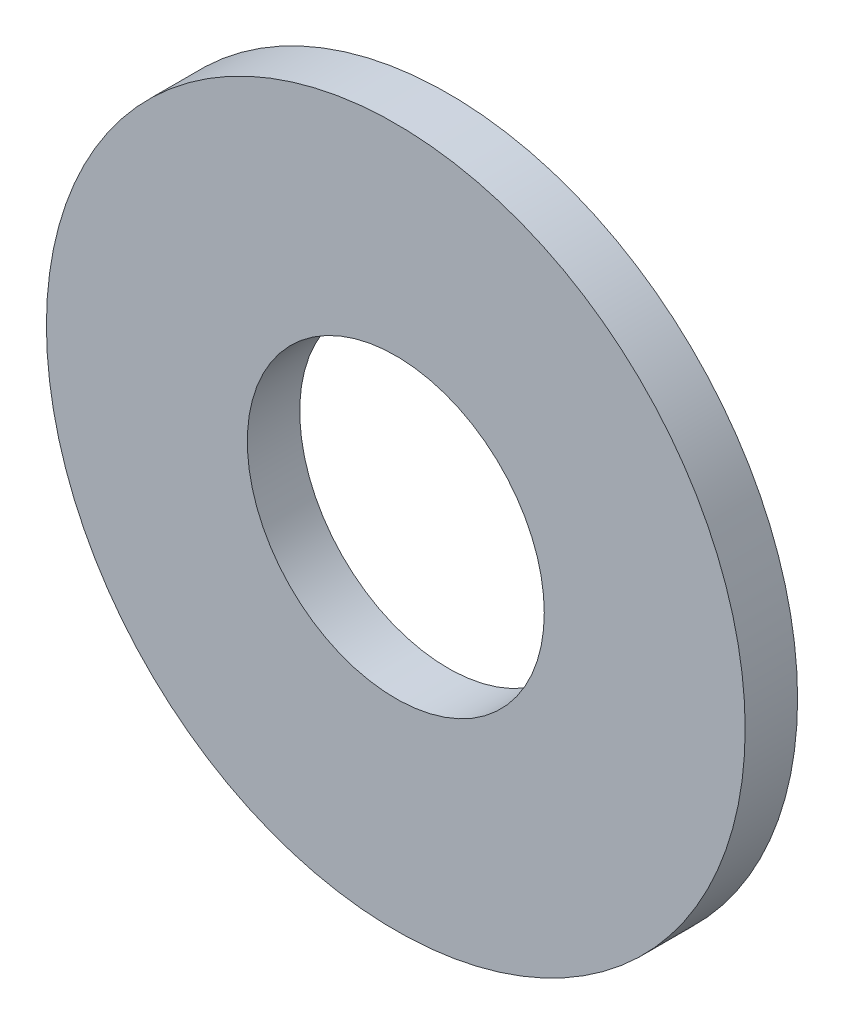
ISO-10303-21;
HEADER;
FILE_DESCRIPTION(('STEP AP214'),'2;1');
FILE_NAME('part.step','',(''),(''),'','','');
FILE_SCHEMA(('AUTOMOTIVE_DESIGN { 1 0 10303 214 1 1 1 1 }'));
ENDSEC;
DATA;
#1=APPLICATION_CONTEXT('core data for automotive mechanical design processes');
#2=APPLICATION_PROTOCOL_DEFINITION('international standard','automotive_design',2000,#1);
#3=PRODUCT_CONTEXT('',#1,'mechanical');
#4=PRODUCT('Part','Part','',(#3));
#5=PRODUCT_RELATED_PRODUCT_CATEGORY('part','',(#4));
#6=PRODUCT_DEFINITION_FORMATION('','',#4);
#7=PRODUCT_DEFINITION_CONTEXT('part definition',#1,'design');
#8=PRODUCT_DEFINITION('design','',#6,#7);
#9=PRODUCT_DEFINITION_SHAPE('','',#8);
#10=(LENGTH_UNIT() NAMED_UNIT(*) SI_UNIT(.MILLI.,.METRE.));
#11=(NAMED_UNIT(*) PLANE_ANGLE_UNIT() SI_UNIT($,.RADIAN.));
#12=(NAMED_UNIT(*) SI_UNIT($,.STERADIAN.) SOLID_ANGLE_UNIT());
#13=UNCERTAINTY_MEASURE_WITH_UNIT(LENGTH_MEASURE(1.E-05),#10,'distance_accuracy_value','');
#14=(GEOMETRIC_REPRESENTATION_CONTEXT(3) GLOBAL_UNCERTAINTY_ASSIGNED_CONTEXT((#13)) GLOBAL_UNIT_ASSIGNED_CONTEXT((#10,
#11,#12)) REPRESENTATION_CONTEXT('',''));
#15=CARTESIAN_POINT('',(0.,0.,0.));
#16=DIRECTION('',(0.,0.,1.));
#17=DIRECTION('',(1.,0.,0.));
#18=AXIS2_PLACEMENT_3D('',#15,#16,#17);
#19=CARTESIAN_POINT('',(0.,0.,0.3));
#20=DIRECTION('',(0.,0.,-1.));
#21=DIRECTION('',(-1.,0.,0.));
#22=AXIS2_PLACEMENT_3D('',#19,#20,#21);
#23=CYLINDRICAL_SURFACE('',#22,2.);
#24=CARTESIAN_POINT('',(0.,0.,0.3));
#25=DIRECTION('',(0.,0.,1.));
#26=DIRECTION('',(1.,0.,0.));
#27=AXIS2_PLACEMENT_3D('',#24,#25,#26);
#28=CIRCLE('',#27,2.);
#29=CARTESIAN_POINT('',(2.,0.,0.3));
#30=VERTEX_POINT('',#29);
#31=EDGE_CURVE('E10',#30,#30,#28,.T.);
#32=ORIENTED_EDGE('',*,*,#31,.F.);
#33=EDGE_LOOP('',(#32));
#34=FACE_BOUND('',#33,.T.);
#35=CARTESIAN_POINT('',(0.,0.,0.));
#36=DIRECTION('',(0.,0.,1.));
#37=DIRECTION('',(1.,0.,0.));
#38=AXIS2_PLACEMENT_3D('',#35,#36,#37);
#39=CIRCLE('',#38,2.);
#40=CARTESIAN_POINT('',(2.,0.,0.));
#41=VERTEX_POINT('',#40);
#42=EDGE_CURVE('E32',#41,#41,#39,.T.);
#43=ORIENTED_EDGE('',*,*,#42,.T.);
#44=EDGE_LOOP('',(#43));
#45=FACE_BOUND('',#44,.T.);
#46=ADVANCED_FACE('F29',(#34,#45),#23,.T.);
#47=CARTESIAN_POINT('',(0.,0.,0.3));
#48=DIRECTION('',(0.,0.,1.));
#49=DIRECTION('',(1.,0.,0.));
#50=AXIS2_PLACEMENT_3D('',#47,#48,#49);
#51=PLANE('',#50);
#52=CARTESIAN_POINT('',(0.,0.,0.3));
#53=DIRECTION('',(0.,0.,1.));
#54=DIRECTION('',(1.,0.,0.));
#55=AXIS2_PLACEMENT_3D('',#52,#53,#54);
#56=CIRCLE('',#55,0.85);
#57=CARTESIAN_POINT('',(0.85,0.,0.3));
#58=VERTEX_POINT('',#57);
#59=EDGE_CURVE('E41',#58,#58,#56,.T.);
#60=ORIENTED_EDGE('',*,*,#59,.F.);
#61=EDGE_LOOP('',(#60));
#62=FACE_BOUND('',#61,.T.);
#63=ORIENTED_EDGE('',*,*,#31,.T.);
#64=EDGE_LOOP('',(#63));
#65=FACE_BOUND('',#64,.T.);
#66=ADVANCED_FACE('F56',(#62,#65),#51,.T.);
#67=CARTESIAN_POINT('',(0.,0.,0.));
#68=DIRECTION('',(0.,0.,1.));
#69=DIRECTION('',(1.,0.,0.));
#70=AXIS2_PLACEMENT_3D('',#67,#68,#69);
#71=PLANE('',#70);
#72=CARTESIAN_POINT('',(0.,0.,0.));
#73=DIRECTION('',(0.,0.,1.));
#74=DIRECTION('',(1.,0.,0.));
#75=AXIS2_PLACEMENT_3D('',#72,#73,#74);
#76=CIRCLE('',#75,0.85);
#77=CARTESIAN_POINT('',(0.85,0.,0.));
#78=VERTEX_POINT('',#77);
#79=EDGE_CURVE('E39',#78,#78,#76,.T.);
#80=ORIENTED_EDGE('',*,*,#79,.T.);
#81=EDGE_LOOP('',(#80));
#82=FACE_BOUND('',#81,.T.);
#83=ORIENTED_EDGE('',*,*,#42,.F.);
#84=EDGE_LOOP('',(#83));
#85=FACE_BOUND('',#84,.T.);
#86=ADVANCED_FACE('F47',(#82,#85),#71,.F.);
#87=CARTESIAN_POINT('',(0.,0.,0.));
#88=DIRECTION('',(0.,0.,1.));
#89=DIRECTION('',(1.,0.,0.));
#90=AXIS2_PLACEMENT_3D('',#87,#88,#89);
#91=CYLINDRICAL_SURFACE('',#90,0.85);
#92=ORIENTED_EDGE('',*,*,#79,.F.);
#93=EDGE_LOOP('',(#92));
#94=FACE_BOUND('',#93,.T.);
#95=ORIENTED_EDGE('',*,*,#59,.T.);
#96=EDGE_LOOP('',(#95));
#97=FACE_BOUND('',#96,.T.);
#98=ADVANCED_FACE('F50',(#94,#97),#91,.F.);
#99=CLOSED_SHELL('',(#46,#66,#86,#98));
#100=MANIFOLD_SOLID_BREP('B2',#99);
#101=ADVANCED_BREP_SHAPE_REPRESENTATION('',(#18,#100),#14);
#102=SHAPE_DEFINITION_REPRESENTATION(#9,#101);
ENDSEC;
END-ISO-10303-21;
